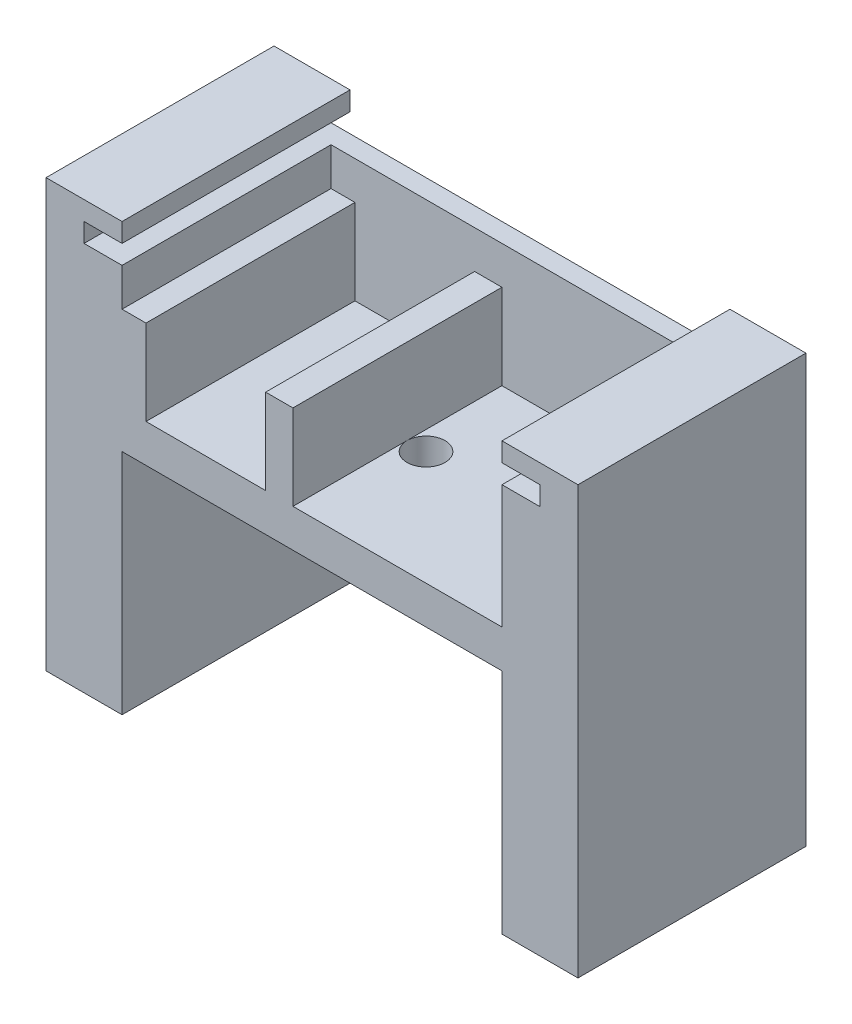
ISO-10303-21;
HEADER;
FILE_DESCRIPTION(('STEP AP214'),'2;1');
FILE_NAME('part.step','',(''),(''),'','','');
FILE_SCHEMA(('AUTOMOTIVE_DESIGN { 1 0 10303 214 1 1 1 1 }'));
ENDSEC;
DATA;
#1=APPLICATION_CONTEXT('core data for automotive mechanical design processes');
#2=APPLICATION_PROTOCOL_DEFINITION('international standard','automotive_design',2000,#1);
#3=PRODUCT_CONTEXT('',#1,'mechanical');
#4=PRODUCT('Part','Part','',(#3));
#5=PRODUCT_RELATED_PRODUCT_CATEGORY('part','',(#4));
#6=PRODUCT_DEFINITION_FORMATION('','',#4);
#7=PRODUCT_DEFINITION_CONTEXT('part definition',#1,'design');
#8=PRODUCT_DEFINITION('design','',#6,#7);
#9=PRODUCT_DEFINITION_SHAPE('','',#8);
#10=(LENGTH_UNIT() NAMED_UNIT(*) SI_UNIT(.MILLI.,.METRE.));
#11=(NAMED_UNIT(*) PLANE_ANGLE_UNIT() SI_UNIT($,.RADIAN.));
#12=(NAMED_UNIT(*) SI_UNIT($,.STERADIAN.) SOLID_ANGLE_UNIT());
#13=UNCERTAINTY_MEASURE_WITH_UNIT(LENGTH_MEASURE(1.E-05),#10,'distance_accuracy_value','');
#14=(GEOMETRIC_REPRESENTATION_CONTEXT(3) GLOBAL_UNCERTAINTY_ASSIGNED_CONTEXT((#13)) GLOBAL_UNIT_ASSIGNED_CONTEXT((#10,
#11,#12)) REPRESENTATION_CONTEXT('',''));
#15=CARTESIAN_POINT('',(0.,0.,0.));
#16=DIRECTION('',(0.,0.,1.));
#17=DIRECTION('',(1.,0.,0.));
#18=AXIS2_PLACEMENT_3D('',#15,#16,#17);
#19=CARTESIAN_POINT('',(63.5,53.9,76.2));
#20=DIRECTION('',(1.,0.,0.));
#21=DIRECTION('',(0.,0.,-1.));
#22=AXIS2_PLACEMENT_3D('',#19,#20,#21);
#23=PLANE('',#22);
#24=DIRECTION('',(0.,1.,0.));
#25=VECTOR('',#24,1.);
#26=CARTESIAN_POINT('',(63.5,53.9,6.35));
#27=LINE('',#26,#25);
#28=CARTESIAN_POINT('',(63.5,12.7,6.35000000000002));
#29=VERTEX_POINT('',#28);
#30=CARTESIAN_POINT('',(63.5,53.9,6.35000000000002));
#31=VERTEX_POINT('',#30);
#32=EDGE_CURVE('E59',#29,#31,#27,.T.);
#33=ORIENTED_EDGE('',*,*,#32,.F.);
#34=DIRECTION('',(0.,0.,-1.));
#35=VECTOR('',#34,1.);
#36=CARTESIAN_POINT('',(63.5,12.7,76.2));
#37=LINE('',#36,#35);
#38=CARTESIAN_POINT('',(63.5,12.7,76.2));
#39=VERTEX_POINT('',#38);
#40=EDGE_CURVE('E364',#39,#29,#37,.T.);
#41=ORIENTED_EDGE('',*,*,#40,.F.);
#42=DIRECTION('',(0.,-1.,0.));
#43=VECTOR('',#42,1.);
#44=CARTESIAN_POINT('',(63.5,53.9,76.2));
#45=LINE('',#44,#43);
#46=CARTESIAN_POINT('',(63.5,53.9,76.2));
#47=VERTEX_POINT('',#46);
#48=EDGE_CURVE('E416',#47,#39,#45,.T.);
#49=ORIENTED_EDGE('',*,*,#48,.F.);
#50=DIRECTION('',(0.,0.,-1.));
#51=VECTOR('',#50,1.);
#52=CARTESIAN_POINT('',(63.5,53.9,76.2));
#53=LINE('',#52,#51);
#54=EDGE_CURVE('E55',#47,#31,#53,.T.);
#55=ORIENTED_EDGE('',*,*,#54,.T.);
#56=EDGE_LOOP('',(#33,#41,#49,#55));
#57=FACE_BOUND('',#56,.T.);
#58=ADVANCED_FACE('F39',(#57),#23,.F.);
#59=CARTESIAN_POINT('',(-6.37146106707273,12.7,76.2));
#60=DIRECTION('',(0.,-1.,0.));
#61=DIRECTION('',(0.,0.,-1.));
#62=AXIS2_PLACEMENT_3D('',#59,#60,#61);
#63=PLANE('',#62);
#64=CARTESIAN_POINT('',(0.,12.7,38.1));
#65=DIRECTION('',(0.,-1.,0.));
#66=DIRECTION('',(0.,0.,-1.));
#67=AXIS2_PLACEMENT_3D('',#64,#65,#66);
#68=CIRCLE('',#67,6.35);
#69=CARTESIAN_POINT('',(0.,12.7,31.75));
#70=VERTEX_POINT('',#69);
#71=EDGE_CURVE('E587',#70,#70,#68,.T.);
#72=ORIENTED_EDGE('',*,*,#71,.T.);
#73=EDGE_LOOP('',(#72));
#74=FACE_BOUND('',#73,.T.);
#75=DIRECTION('',(1.,0.,0.));
#76=VECTOR('',#75,1.);
#77=CARTESIAN_POINT('',(-63.4999999999999,12.7,6.34999999999999));
#78=LINE('',#77,#76);
#79=CARTESIAN_POINT('',(-6.37146106707273,12.7,6.35000000000002));
#80=VERTEX_POINT('',#79);
#81=EDGE_CURVE('E567',#80,#29,#78,.T.);
#82=ORIENTED_EDGE('',*,*,#81,.F.);
#83=DIRECTION('',(0.,0.,-1.));
#84=VECTOR('',#83,1.);
#85=CARTESIAN_POINT('',(-6.37146106707273,12.7,76.2));
#86=LINE('',#85,#84);
#87=CARTESIAN_POINT('',(-6.37146106707273,12.7,76.2));
#88=VERTEX_POINT('',#87);
#89=EDGE_CURVE('E360',#88,#80,#86,.T.);
#90=ORIENTED_EDGE('',*,*,#89,.F.);
#91=DIRECTION('',(-1.,0.,0.));
#92=VECTOR('',#91,1.);
#93=CARTESIAN_POINT('',(-6.37146106707273,12.7,76.2));
#94=LINE('',#93,#92);
#95=EDGE_CURVE('E419',#39,#88,#94,.T.);
#96=ORIENTED_EDGE('',*,*,#95,.F.);
#97=ORIENTED_EDGE('',*,*,#40,.T.);
#98=EDGE_LOOP('',(#82,#90,#96,#97));
#99=FACE_BOUND('',#98,.T.);
#100=ADVANCED_FACE('F526',(#74,#99),#63,.F.);
#101=CARTESIAN_POINT('',(-6.37146106707273,41.2,76.2));
#102=DIRECTION('',(-1.,0.,0.));
#103=DIRECTION('',(0.,0.,1.));
#104=AXIS2_PLACEMENT_3D('',#101,#102,#103);
#105=PLANE('',#104);
#106=DIRECTION('',(0.,-1.,0.));
#107=VECTOR('',#106,1.);
#108=CARTESIAN_POINT('',(-6.37146106707273,41.2,6.34999999999999));
#109=LINE('',#108,#107);
#110=CARTESIAN_POINT('',(-6.37146106707273,41.2,6.35000000000002));
#111=VERTEX_POINT('',#110);
#112=EDGE_CURVE('E241',#111,#80,#109,.T.);
#113=ORIENTED_EDGE('',*,*,#112,.F.);
#114=DIRECTION('',(0.,0.,-1.));
#115=VECTOR('',#114,1.);
#116=CARTESIAN_POINT('',(-6.37146106707273,41.2,76.2));
#117=LINE('',#116,#115);
#118=CARTESIAN_POINT('',(-6.37146106707273,41.2,76.2));
#119=VERTEX_POINT('',#118);
#120=EDGE_CURVE('E356',#119,#111,#117,.T.);
#121=ORIENTED_EDGE('',*,*,#120,.F.);
#122=DIRECTION('',(0.,1.,0.));
#123=VECTOR('',#122,1.);
#124=CARTESIAN_POINT('',(-6.37146106707273,41.2,76.2));
#125=LINE('',#124,#123);
#126=EDGE_CURVE('E422',#88,#119,#125,.T.);
#127=ORIENTED_EDGE('',*,*,#126,.F.);
#128=ORIENTED_EDGE('',*,*,#89,.T.);
#129=EDGE_LOOP('',(#113,#121,#127,#128));
#130=FACE_BOUND('',#129,.T.);
#131=ADVANCED_FACE('F532',(#130),#105,.F.);
#132=CARTESIAN_POINT('',(-15.5,41.2,76.2));
#133=DIRECTION('',(0.,-1.,0.));
#134=DIRECTION('',(0.,0.,-1.));
#135=AXIS2_PLACEMENT_3D('',#132,#133,#134);
#136=PLANE('',#135);
#137=DIRECTION('',(1.,0.,0.));
#138=VECTOR('',#137,1.);
#139=CARTESIAN_POINT('',(-15.5,41.2,6.34999999999999));
#140=LINE('',#139,#138);
#141=CARTESIAN_POINT('',(-15.5,41.2,6.35000000000002));
#142=VERTEX_POINT('',#141);
#143=EDGE_CURVE('E248',#142,#111,#140,.T.);
#144=ORIENTED_EDGE('',*,*,#143,.F.);
#145=DIRECTION('',(0.,0.,-1.));
#146=VECTOR('',#145,1.);
#147=CARTESIAN_POINT('',(-15.5,41.2,76.2));
#148=LINE('',#147,#146);
#149=CARTESIAN_POINT('',(-15.5,41.2,76.2));
#150=VERTEX_POINT('',#149);
#151=EDGE_CURVE('E352',#150,#142,#148,.T.);
#152=ORIENTED_EDGE('',*,*,#151,.F.);
#153=DIRECTION('',(-1.,0.,0.));
#154=VECTOR('',#153,1.);
#155=CARTESIAN_POINT('',(-15.5,41.2,76.2));
#156=LINE('',#155,#154);
#157=EDGE_CURVE('E425',#119,#150,#156,.T.);
#158=ORIENTED_EDGE('',*,*,#157,.F.);
#159=ORIENTED_EDGE('',*,*,#120,.T.);
#160=EDGE_LOOP('',(#144,#152,#158,#159));
#161=FACE_BOUND('',#160,.T.);
#162=ADVANCED_FACE('F535',(#161),#136,.F.);
#163=CARTESIAN_POINT('',(-15.5,12.7,76.2));
#164=DIRECTION('',(1.,0.,0.));
#165=DIRECTION('',(0.,0.,-1.));
#166=AXIS2_PLACEMENT_3D('',#163,#164,#165);
#167=PLANE('',#166);
#168=DIRECTION('',(0.,1.,0.));
#169=VECTOR('',#168,1.);
#170=CARTESIAN_POINT('',(-15.5,12.7,6.34999999999999));
#171=LINE('',#170,#169);
#172=CARTESIAN_POINT('',(-15.5,12.7,6.35000000000002));
#173=VERTEX_POINT('',#172);
#174=EDGE_CURVE('E580',#173,#142,#171,.T.);
#175=ORIENTED_EDGE('',*,*,#174,.F.);
#176=DIRECTION('',(0.,0.,-1.));
#177=VECTOR('',#176,1.);
#178=CARTESIAN_POINT('',(-15.5,12.7,76.2));
#179=LINE('',#178,#177);
#180=CARTESIAN_POINT('',(-15.5,12.7,76.2));
#181=VERTEX_POINT('',#180);
#182=EDGE_CURVE('E348',#181,#173,#179,.T.);
#183=ORIENTED_EDGE('',*,*,#182,.F.);
#184=DIRECTION('',(0.,-1.,0.));
#185=VECTOR('',#184,1.);
#186=CARTESIAN_POINT('',(-15.5,12.7,76.2));
#187=LINE('',#186,#185);
#188=EDGE_CURVE('E428',#150,#181,#187,.T.);
#189=ORIENTED_EDGE('',*,*,#188,.F.);
#190=ORIENTED_EDGE('',*,*,#151,.T.);
#191=EDGE_LOOP('',(#175,#183,#189,#190));
#192=FACE_BOUND('',#191,.T.);
#193=ADVANCED_FACE('F540',(#192),#167,.F.);
#194=CARTESIAN_POINT('',(-55.5,12.7,76.2));
#195=DIRECTION('',(0.,-1.,0.));
#196=DIRECTION('',(0.,0.,-1.));
#197=AXIS2_PLACEMENT_3D('',#194,#195,#196);
#198=PLANE('',#197);
#199=CARTESIAN_POINT('',(-55.5,12.7,6.35000000000002));
#200=VERTEX_POINT('',#199);
#201=EDGE_CURVE('E548',#200,#173,#78,.T.);
#202=ORIENTED_EDGE('',*,*,#201,.F.);
#203=DIRECTION('',(0.,0.,-1.));
#204=VECTOR('',#203,1.);
#205=CARTESIAN_POINT('',(-55.5,12.7,76.2));
#206=LINE('',#205,#204);
#207=CARTESIAN_POINT('',(-55.5,12.7,76.2));
#208=VERTEX_POINT('',#207);
#209=EDGE_CURVE('E344',#208,#200,#206,.T.);
#210=ORIENTED_EDGE('',*,*,#209,.F.);
#211=DIRECTION('',(-1.,0.,0.));
#212=VECTOR('',#211,1.);
#213=CARTESIAN_POINT('',(-55.5,12.7,76.2));
#214=LINE('',#213,#212);
#215=EDGE_CURVE('E431',#181,#208,#214,.T.);
#216=ORIENTED_EDGE('',*,*,#215,.F.);
#217=ORIENTED_EDGE('',*,*,#182,.T.);
#218=EDGE_LOOP('',(#202,#210,#216,#217));
#219=FACE_BOUND('',#218,.T.);
#220=ADVANCED_FACE('F546',(#219),#198,.F.);
#221=CARTESIAN_POINT('',(-55.5,41.2,76.2));
#222=DIRECTION('',(-1.,0.,0.));
#223=DIRECTION('',(0.,-1.,0.));
#224=AXIS2_PLACEMENT_3D('',#221,#222,#223);
#225=PLANE('',#224);
#226=DIRECTION('',(0.,-1.,0.));
#227=VECTOR('',#226,1.);
#228=CARTESIAN_POINT('',(-55.5,41.2,6.34999999999999));
#229=LINE('',#228,#227);
#230=CARTESIAN_POINT('',(-55.5,41.2,6.35000000000002));
#231=VERTEX_POINT('',#230);
#232=EDGE_CURVE('E553',#231,#200,#229,.T.);
#233=ORIENTED_EDGE('',*,*,#232,.F.);
#234=DIRECTION('',(0.,0.,-1.));
#235=VECTOR('',#234,1.);
#236=CARTESIAN_POINT('',(-55.5,41.2,76.2));
#237=LINE('',#236,#235);
#238=CARTESIAN_POINT('',(-55.5,41.2,76.2));
#239=VERTEX_POINT('',#238);
#240=EDGE_CURVE('E340',#239,#231,#237,.T.);
#241=ORIENTED_EDGE('',*,*,#240,.F.);
#242=DIRECTION('',(0.,1.,0.));
#243=VECTOR('',#242,1.);
#244=CARTESIAN_POINT('',(-55.5,41.2,76.2));
#245=LINE('',#244,#243);
#246=EDGE_CURVE('E434',#208,#239,#245,.T.);
#247=ORIENTED_EDGE('',*,*,#246,.F.);
#248=ORIENTED_EDGE('',*,*,#209,.T.);
#249=EDGE_LOOP('',(#233,#241,#247,#248));
#250=FACE_BOUND('',#249,.T.);
#251=ADVANCED_FACE('F551',(#250),#225,.F.);
#252=CARTESIAN_POINT('',(-63.5,41.2,76.2));
#253=DIRECTION('',(0.,-1.,0.));
#254=DIRECTION('',(0.,0.,-1.));
#255=AXIS2_PLACEMENT_3D('',#252,#253,#254);
#256=PLANE('',#255);
#257=DIRECTION('',(1.,0.,0.));
#258=VECTOR('',#257,1.);
#259=CARTESIAN_POINT('',(-63.5,41.2,6.34999999999999));
#260=LINE('',#259,#258);
#261=CARTESIAN_POINT('',(-63.5,41.2,6.35000000000002));
#262=VERTEX_POINT('',#261);
#263=EDGE_CURVE('E575',#262,#231,#260,.T.);
#264=ORIENTED_EDGE('',*,*,#263,.F.);
#265=DIRECTION('',(0.,0.,-1.));
#266=VECTOR('',#265,1.);
#267=CARTESIAN_POINT('',(-63.5,41.2,76.2));
#268=LINE('',#267,#266);
#269=CARTESIAN_POINT('',(-63.5,41.2,76.2));
#270=VERTEX_POINT('',#269);
#271=EDGE_CURVE('E336',#270,#262,#268,.T.);
#272=ORIENTED_EDGE('',*,*,#271,.F.);
#273=DIRECTION('',(-1.,0.,0.));
#274=VECTOR('',#273,1.);
#275=CARTESIAN_POINT('',(-63.5,41.2,76.2));
#276=LINE('',#275,#274);
#277=EDGE_CURVE('E437',#239,#270,#276,.T.);
#278=ORIENTED_EDGE('',*,*,#277,.F.);
#279=ORIENTED_EDGE('',*,*,#240,.T.);
#280=EDGE_LOOP('',(#264,#272,#278,#279));
#281=FACE_BOUND('',#280,.T.);
#282=ADVANCED_FACE('F557',(#281),#256,.F.);
#283=CARTESIAN_POINT('',(-63.5,53.9,76.2));
#284=DIRECTION('',(-1.,0.,0.));
#285=DIRECTION('',(0.,0.,1.));
#286=AXIS2_PLACEMENT_3D('',#283,#284,#285);
#287=PLANE('',#286);
#288=DIRECTION('',(0.,1.,0.));
#289=VECTOR('',#288,1.);
#290=CARTESIAN_POINT('',(-63.4999999999999,53.9,6.35));
#291=LINE('',#290,#289);
#292=CARTESIAN_POINT('',(-63.5,53.9,6.35000000000002));
#293=VERTEX_POINT('',#292);
#294=EDGE_CURVE('E563',#262,#293,#291,.T.);
#295=ORIENTED_EDGE('',*,*,#294,.T.);
#296=DIRECTION('',(0.,0.,-1.));
#297=VECTOR('',#296,1.);
#298=CARTESIAN_POINT('',(-63.5,53.9,76.2));
#299=LINE('',#298,#297);
#300=CARTESIAN_POINT('',(-63.5,53.9,76.2));
#301=VERTEX_POINT('',#300);
#302=EDGE_CURVE('E332',#301,#293,#299,.T.);
#303=ORIENTED_EDGE('',*,*,#302,.F.);
#304=DIRECTION('',(0.,1.,0.));
#305=VECTOR('',#304,1.);
#306=CARTESIAN_POINT('',(-63.5,53.9,76.2));
#307=LINE('',#306,#305);
#308=EDGE_CURVE('E440',#270,#301,#307,.T.);
#309=ORIENTED_EDGE('',*,*,#308,.F.);
#310=ORIENTED_EDGE('',*,*,#271,.T.);
#311=EDGE_LOOP('',(#295,#303,#309,#310));
#312=FACE_BOUND('',#311,.T.);
#313=ADVANCED_FACE('F561',(#312),#287,.F.);
#314=CARTESIAN_POINT('',(63.5,-76.2,76.2));
#315=DIRECTION('',(0.,1.,0.));
#316=DIRECTION('',(0.,0.,1.));
#317=AXIS2_PLACEMENT_3D('',#314,#315,#316);
#318=PLANE('',#317);
#319=DIRECTION('',(1.,0.,0.));
#320=VECTOR('',#319,1.);
#321=CARTESIAN_POINT('',(63.5,-76.2,0.));
#322=LINE('',#321,#320);
#323=CARTESIAN_POINT('',(63.5,-76.2,0.));
#324=VERTEX_POINT('',#323);
#325=CARTESIAN_POINT('',(88.9,-76.2,0.));
#326=VERTEX_POINT('',#325);
#327=EDGE_CURVE('E235',#324,#326,#322,.T.);
#328=ORIENTED_EDGE('',*,*,#327,.T.);
#329=DIRECTION('',(0.,0.,-1.));
#330=VECTOR('',#329,1.);
#331=CARTESIAN_POINT('',(88.9,-76.2,76.2));
#332=LINE('',#331,#330);
#333=CARTESIAN_POINT('',(88.9,-76.2,76.2));
#334=VERTEX_POINT('',#333);
#335=EDGE_CURVE('E11',#334,#326,#332,.T.);
#336=ORIENTED_EDGE('',*,*,#335,.F.);
#337=DIRECTION('',(1.,0.,0.));
#338=VECTOR('',#337,1.);
#339=CARTESIAN_POINT('',(63.5,-76.2,76.2));
#340=LINE('',#339,#338);
#341=CARTESIAN_POINT('',(63.5,-76.2,76.2));
#342=VERTEX_POINT('',#341);
#343=EDGE_CURVE('E222',#342,#334,#340,.T.);
#344=ORIENTED_EDGE('',*,*,#343,.F.);
#345=DIRECTION('',(0.,0.,-1.));
#346=VECTOR('',#345,1.);
#347=CARTESIAN_POINT('',(63.5,-76.2,76.2));
#348=LINE('',#347,#346);
#349=EDGE_CURVE('E236',#342,#324,#348,.T.);
#350=ORIENTED_EDGE('',*,*,#349,.T.);
#351=EDGE_LOOP('',(#328,#336,#344,#350));
#352=FACE_BOUND('',#351,.T.);
#353=ADVANCED_FACE('F41',(#352),#318,.F.);
#354=CARTESIAN_POINT('',(88.9,66.6,76.2));
#355=DIRECTION('',(-1.,0.,0.));
#356=DIRECTION('',(0.,0.,1.));
#357=AXIS2_PLACEMENT_3D('',#354,#355,#356);
#358=PLANE('',#357);
#359=DIRECTION('',(0.,1.,0.));
#360=VECTOR('',#359,1.);
#361=CARTESIAN_POINT('',(88.9,66.6,0.));
#362=LINE('',#361,#360);
#363=CARTESIAN_POINT('',(88.9,66.6,0.));
#364=VERTEX_POINT('',#363);
#365=EDGE_CURVE('E240',#326,#364,#362,.T.);
#366=ORIENTED_EDGE('',*,*,#365,.T.);
#367=DIRECTION('',(0.,0.,-1.));
#368=VECTOR('',#367,1.);
#369=CARTESIAN_POINT('',(88.9,66.6,76.2));
#370=LINE('',#369,#368);
#371=CARTESIAN_POINT('',(88.9,66.6,76.2));
#372=VERTEX_POINT('',#371);
#373=EDGE_CURVE('E48',#372,#364,#370,.T.);
#374=ORIENTED_EDGE('',*,*,#373,.F.);
#375=DIRECTION('',(0.,1.,0.));
#376=VECTOR('',#375,1.);
#377=CARTESIAN_POINT('',(88.9,66.6,76.2));
#378=LINE('',#377,#376);
#379=EDGE_CURVE('E212',#334,#372,#378,.T.);
#380=ORIENTED_EDGE('',*,*,#379,.F.);
#381=ORIENTED_EDGE('',*,*,#335,.T.);
#382=EDGE_LOOP('',(#366,#374,#380,#381));
#383=FACE_BOUND('',#382,.T.);
#384=ADVANCED_FACE('F214',(#383),#358,.F.);
#385=CARTESIAN_POINT('',(63.5,66.6,76.2));
#386=DIRECTION('',(0.,-1.,0.));
#387=DIRECTION('',(0.,0.,-1.));
#388=AXIS2_PLACEMENT_3D('',#385,#386,#387);
#389=PLANE('',#388);
#390=DIRECTION('',(-1.,0.,0.));
#391=VECTOR('',#390,1.);
#392=CARTESIAN_POINT('',(63.5,66.6,0.));
#393=LINE('',#392,#391);
#394=CARTESIAN_POINT('',(63.5,66.6,0.));
#395=VERTEX_POINT('',#394);
#396=EDGE_CURVE('E245',#364,#395,#393,.T.);
#397=ORIENTED_EDGE('',*,*,#396,.T.);
#398=DIRECTION('',(0.,0.,-1.));
#399=VECTOR('',#398,1.);
#400=CARTESIAN_POINT('',(63.5,66.6,76.2));
#401=LINE('',#400,#399);
#402=CARTESIAN_POINT('',(63.5,66.6,76.2));
#403=VERTEX_POINT('',#402);
#404=EDGE_CURVE('E381',#403,#395,#401,.T.);
#405=ORIENTED_EDGE('',*,*,#404,.F.);
#406=DIRECTION('',(-1.,0.,0.));
#407=VECTOR('',#406,1.);
#408=CARTESIAN_POINT('',(63.5,66.6,76.2));
#409=LINE('',#408,#407);
#410=EDGE_CURVE('E221',#372,#403,#409,.T.);
#411=ORIENTED_EDGE('',*,*,#410,.F.);
#412=ORIENTED_EDGE('',*,*,#373,.T.);
#413=EDGE_LOOP('',(#397,#405,#411,#412));
#414=FACE_BOUND('',#413,.T.);
#415=ADVANCED_FACE('F387',(#414),#389,.F.);
#416=CARTESIAN_POINT('',(63.5,66.6,76.2));
#417=DIRECTION('',(1.,0.,0.));
#418=DIRECTION('',(0.,0.,-1.));
#419=AXIS2_PLACEMENT_3D('',#416,#417,#418);
#420=PLANE('',#419);
#421=DIRECTION('',(0.,-1.,0.));
#422=VECTOR('',#421,1.);
#423=CARTESIAN_POINT('',(63.5,66.6,0.));
#424=LINE('',#423,#422);
#425=CARTESIAN_POINT('',(63.5,60.25,0.));
#426=VERTEX_POINT('',#425);
#427=EDGE_CURVE('E255',#395,#426,#424,.T.);
#428=ORIENTED_EDGE('',*,*,#427,.T.);
#429=DIRECTION('',(0.,0.,-1.));
#430=VECTOR('',#429,1.);
#431=CARTESIAN_POINT('',(63.5,60.25,76.2));
#432=LINE('',#431,#430);
#433=CARTESIAN_POINT('',(63.5,60.25,76.2));
#434=VERTEX_POINT('',#433);
#435=EDGE_CURVE('E377',#434,#426,#432,.T.);
#436=ORIENTED_EDGE('',*,*,#435,.F.);
#437=DIRECTION('',(0.,-1.,0.));
#438=VECTOR('',#437,1.);
#439=CARTESIAN_POINT('',(63.5,66.6,76.2));
#440=LINE('',#439,#438);
#441=EDGE_CURVE('E405',#403,#434,#440,.T.);
#442=ORIENTED_EDGE('',*,*,#441,.F.);
#443=ORIENTED_EDGE('',*,*,#404,.T.);
#444=EDGE_LOOP('',(#428,#436,#442,#443));
#445=FACE_BOUND('',#444,.T.);
#446=ADVANCED_FACE('F395',(#445),#420,.F.);
#447=CARTESIAN_POINT('',(63.5,60.25,76.2));
#448=DIRECTION('',(0.,1.,0.));
#449=DIRECTION('',(0.,0.,1.));
#450=AXIS2_PLACEMENT_3D('',#447,#448,#449);
#451=PLANE('',#450);
#452=DIRECTION('',(1.,0.,0.));
#453=VECTOR('',#452,1.);
#454=CARTESIAN_POINT('',(63.5,60.25,0.));
#455=LINE('',#454,#453);
#456=CARTESIAN_POINT('',(76.2,60.25,0.));
#457=VERTEX_POINT('',#456);
#458=EDGE_CURVE('E258',#426,#457,#455,.T.);
#459=ORIENTED_EDGE('',*,*,#458,.T.);
#460=DIRECTION('',(0.,0.,-1.));
#461=VECTOR('',#460,1.);
#462=CARTESIAN_POINT('',(76.2,60.25,76.2));
#463=LINE('',#462,#461);
#464=CARTESIAN_POINT('',(76.2,60.25,76.2));
#465=VERTEX_POINT('',#464);
#466=EDGE_CURVE('E373',#465,#457,#463,.T.);
#467=ORIENTED_EDGE('',*,*,#466,.F.);
#468=DIRECTION('',(1.,0.,0.));
#469=VECTOR('',#468,1.);
#470=CARTESIAN_POINT('',(63.5,60.25,76.2));
#471=LINE('',#470,#469);
#472=EDGE_CURVE('E401',#434,#465,#471,.T.);
#473=ORIENTED_EDGE('',*,*,#472,.F.);
#474=ORIENTED_EDGE('',*,*,#435,.T.);
#475=EDGE_LOOP('',(#459,#467,#473,#474));
#476=FACE_BOUND('',#475,.T.);
#477=ADVANCED_FACE('F399',(#476),#451,.F.);
#478=CARTESIAN_POINT('',(76.2,60.25,76.2));
#479=DIRECTION('',(1.,0.,0.));
#480=DIRECTION('',(0.,0.,-1.));
#481=AXIS2_PLACEMENT_3D('',#478,#479,#480);
#482=PLANE('',#481);
#483=DIRECTION('',(0.,-1.,0.));
#484=VECTOR('',#483,1.);
#485=CARTESIAN_POINT('',(76.2,60.25,0.));
#486=LINE('',#485,#484);
#487=CARTESIAN_POINT('',(76.2,53.9,0.));
#488=VERTEX_POINT('',#487);
#489=EDGE_CURVE('E261',#457,#488,#486,.T.);
#490=ORIENTED_EDGE('',*,*,#489,.T.);
#491=DIRECTION('',(0.,0.,-1.));
#492=VECTOR('',#491,1.);
#493=CARTESIAN_POINT('',(76.2,53.9,76.2));
#494=LINE('',#493,#492);
#495=CARTESIAN_POINT('',(76.2,53.9,76.2));
#496=VERTEX_POINT('',#495);
#497=EDGE_CURVE('E369',#496,#488,#494,.T.);
#498=ORIENTED_EDGE('',*,*,#497,.F.);
#499=DIRECTION('',(0.,-1.,0.));
#500=VECTOR('',#499,1.);
#501=CARTESIAN_POINT('',(76.2,60.25,76.2));
#502=LINE('',#501,#500);
#503=EDGE_CURVE('E404',#465,#496,#502,.T.);
#504=ORIENTED_EDGE('',*,*,#503,.F.);
#505=ORIENTED_EDGE('',*,*,#466,.T.);
#506=EDGE_LOOP('',(#490,#498,#504,#505));
#507=FACE_BOUND('',#506,.T.);
#508=ADVANCED_FACE('F518',(#507),#482,.F.);
#509=CARTESIAN_POINT('',(-76.2,53.9,76.2));
#510=DIRECTION('',(0.,-1.,0.));
#511=DIRECTION('',(0.,0.,-1.));
#512=AXIS2_PLACEMENT_3D('',#509,#510,#511);
#513=PLANE('',#512);
#514=DIRECTION('',(-1.,0.,0.));
#515=VECTOR('',#514,1.);
#516=CARTESIAN_POINT('',(-76.2,53.9,0.));
#517=LINE('',#516,#515);
#518=CARTESIAN_POINT('',(-76.2,53.9,0.));
#519=VERTEX_POINT('',#518);
#520=EDGE_CURVE('E265',#488,#519,#517,.T.);
#521=ORIENTED_EDGE('',*,*,#520,.T.);
#522=DIRECTION('',(0.,0.,-1.));
#523=VECTOR('',#522,1.);
#524=CARTESIAN_POINT('',(-76.2,53.9,76.2));
#525=LINE('',#524,#523);
#526=CARTESIAN_POINT('',(-76.2,53.9,76.2));
#527=VERTEX_POINT('',#526);
#528=EDGE_CURVE('E328',#527,#519,#525,.T.);
#529=ORIENTED_EDGE('',*,*,#528,.F.);
#530=DIRECTION('',(-1.,0.,0.));
#531=VECTOR('',#530,1.);
#532=CARTESIAN_POINT('',(-76.2,53.9,76.2));
#533=LINE('',#532,#531);
#534=EDGE_CURVE('E443',#301,#527,#533,.T.);
#535=ORIENTED_EDGE('',*,*,#534,.F.);
#536=ORIENTED_EDGE('',*,*,#302,.T.);
#537=DIRECTION('',(1.,0.,0.));
#538=VECTOR('',#537,1.);
#539=CARTESIAN_POINT('',(-63.4999999999999,53.9,6.35));
#540=LINE('',#539,#538);
#541=EDGE_CURVE('E521',#293,#31,#540,.T.);
#542=ORIENTED_EDGE('',*,*,#541,.T.);
#543=ORIENTED_EDGE('',*,*,#54,.F.);
#544=DIRECTION('',(-1.,0.,0.));
#545=VECTOR('',#544,1.);
#546=CARTESIAN_POINT('',(76.2,53.9,76.2));
#547=LINE('',#546,#545);
#548=EDGE_CURVE('E409',#496,#47,#547,.T.);
#549=ORIENTED_EDGE('',*,*,#548,.F.);
#550=ORIENTED_EDGE('',*,*,#497,.T.);
#551=EDGE_LOOP('',(#521,#529,#535,#536,#542,#543,#549,#550));
#552=FACE_BOUND('',#551,.T.);
#553=ADVANCED_FACE('F514',(#552),#513,.F.);
#554=CARTESIAN_POINT('',(-76.2,60.25,76.2));
#555=DIRECTION('',(-1.,0.,0.));
#556=DIRECTION('',(0.,-1.,0.));
#557=AXIS2_PLACEMENT_3D('',#554,#555,#556);
#558=PLANE('',#557);
#559=DIRECTION('',(0.,1.,0.));
#560=VECTOR('',#559,1.);
#561=CARTESIAN_POINT('',(-76.2,60.25,0.));
#562=LINE('',#561,#560);
#563=CARTESIAN_POINT('',(-76.2,60.25,0.));
#564=VERTEX_POINT('',#563);
#565=EDGE_CURVE('E268',#519,#564,#562,.T.);
#566=ORIENTED_EDGE('',*,*,#565,.T.);
#567=DIRECTION('',(0.,0.,-1.));
#568=VECTOR('',#567,1.);
#569=CARTESIAN_POINT('',(-76.2,60.25,76.2));
#570=LINE('',#569,#568);
#571=CARTESIAN_POINT('',(-76.2,60.25,76.2));
#572=VERTEX_POINT('',#571);
#573=EDGE_CURVE('E324',#572,#564,#570,.T.);
#574=ORIENTED_EDGE('',*,*,#573,.F.);
#575=DIRECTION('',(0.,1.,0.));
#576=VECTOR('',#575,1.);
#577=CARTESIAN_POINT('',(-76.2,60.25,76.2));
#578=LINE('',#577,#576);
#579=EDGE_CURVE('E446',#527,#572,#578,.T.);
#580=ORIENTED_EDGE('',*,*,#579,.F.);
#581=ORIENTED_EDGE('',*,*,#528,.T.);
#582=EDGE_LOOP('',(#566,#574,#580,#581));
#583=FACE_BOUND('',#582,.T.);
#584=ADVANCED_FACE('F509',(#583),#558,.F.);
#585=CARTESIAN_POINT('',(-63.5,60.25,76.2));
#586=DIRECTION('',(0.,1.,0.));
#587=DIRECTION('',(0.,0.,1.));
#588=AXIS2_PLACEMENT_3D('',#585,#586,#587);
#589=PLANE('',#588);
#590=DIRECTION('',(1.,0.,0.));
#591=VECTOR('',#590,1.);
#592=CARTESIAN_POINT('',(-63.5,60.25,0.));
#593=LINE('',#592,#591);
#594=CARTESIAN_POINT('',(-63.5,60.25,0.));
#595=VERTEX_POINT('',#594);
#596=EDGE_CURVE('E271',#564,#595,#593,.T.);
#597=ORIENTED_EDGE('',*,*,#596,.T.);
#598=DIRECTION('',(0.,0.,-1.));
#599=VECTOR('',#598,1.);
#600=CARTESIAN_POINT('',(-63.5,60.25,76.2));
#601=LINE('',#600,#599);
#602=CARTESIAN_POINT('',(-63.5,60.25,76.2));
#603=VERTEX_POINT('',#602);
#604=EDGE_CURVE('E320',#603,#595,#601,.T.);
#605=ORIENTED_EDGE('',*,*,#604,.F.);
#606=DIRECTION('',(1.,0.,0.));
#607=VECTOR('',#606,1.);
#608=CARTESIAN_POINT('',(-63.5,60.25,76.2));
#609=LINE('',#608,#607);
#610=EDGE_CURVE('E449',#572,#603,#609,.T.);
#611=ORIENTED_EDGE('',*,*,#610,.F.);
#612=ORIENTED_EDGE('',*,*,#573,.T.);
#613=EDGE_LOOP('',(#597,#605,#611,#612));
#614=FACE_BOUND('',#613,.T.);
#615=ADVANCED_FACE('F505',(#614),#589,.F.);
#616=CARTESIAN_POINT('',(-63.5,66.6,76.2));
#617=DIRECTION('',(-1.,0.,0.));
#618=DIRECTION('',(0.,0.,1.));
#619=AXIS2_PLACEMENT_3D('',#616,#617,#618);
#620=PLANE('',#619);
#621=DIRECTION('',(0.,1.,0.));
#622=VECTOR('',#621,1.);
#623=CARTESIAN_POINT('',(-63.5,66.6,0.));
#624=LINE('',#623,#622);
#625=CARTESIAN_POINT('',(-63.5,66.6,0.));
#626=VERTEX_POINT('',#625);
#627=EDGE_CURVE('E274',#595,#626,#624,.T.);
#628=ORIENTED_EDGE('',*,*,#627,.T.);
#629=DIRECTION('',(0.,0.,-1.));
#630=VECTOR('',#629,1.);
#631=CARTESIAN_POINT('',(-63.5,66.6,76.2));
#632=LINE('',#631,#630);
#633=CARTESIAN_POINT('',(-63.5,66.6,76.2));
#634=VERTEX_POINT('',#633);
#635=EDGE_CURVE('E316',#634,#626,#632,.T.);
#636=ORIENTED_EDGE('',*,*,#635,.F.);
#637=DIRECTION('',(0.,1.,0.));
#638=VECTOR('',#637,1.);
#639=CARTESIAN_POINT('',(-63.5,66.6,76.2));
#640=LINE('',#639,#638);
#641=EDGE_CURVE('E452',#603,#634,#640,.T.);
#642=ORIENTED_EDGE('',*,*,#641,.F.);
#643=ORIENTED_EDGE('',*,*,#604,.T.);
#644=EDGE_LOOP('',(#628,#636,#642,#643));
#645=FACE_BOUND('',#644,.T.);
#646=ADVANCED_FACE('F501',(#645),#620,.F.);
#647=CARTESIAN_POINT('',(-88.9,66.6,76.2));
#648=DIRECTION('',(0.,-1.,0.));
#649=DIRECTION('',(0.,0.,-1.));
#650=AXIS2_PLACEMENT_3D('',#647,#648,#649);
#651=PLANE('',#650);
#652=DIRECTION('',(-1.,0.,0.));
#653=VECTOR('',#652,1.);
#654=CARTESIAN_POINT('',(-88.9,66.6,0.));
#655=LINE('',#654,#653);
#656=CARTESIAN_POINT('',(-88.9,66.6,0.));
#657=VERTEX_POINT('',#656);
#658=EDGE_CURVE('E277',#626,#657,#655,.T.);
#659=ORIENTED_EDGE('',*,*,#658,.T.);
#660=DIRECTION('',(0.,0.,-1.));
#661=VECTOR('',#660,1.);
#662=CARTESIAN_POINT('',(-88.9,66.6,76.2));
#663=LINE('',#662,#661);
#664=CARTESIAN_POINT('',(-88.9,66.6,76.2));
#665=VERTEX_POINT('',#664);
#666=EDGE_CURVE('E312',#665,#657,#663,.T.);
#667=ORIENTED_EDGE('',*,*,#666,.F.);
#668=DIRECTION('',(-1.,0.,0.));
#669=VECTOR('',#668,1.);
#670=CARTESIAN_POINT('',(-88.9,66.6,76.2));
#671=LINE('',#670,#669);
#672=EDGE_CURVE('E455',#634,#665,#671,.T.);
#673=ORIENTED_EDGE('',*,*,#672,.F.);
#674=ORIENTED_EDGE('',*,*,#635,.T.);
#675=EDGE_LOOP('',(#659,#667,#673,#674));
#676=FACE_BOUND('',#675,.T.);
#677=ADVANCED_FACE('F496',(#676),#651,.F.);
#678=CARTESIAN_POINT('',(-88.9,-76.2,76.2));
#679=DIRECTION('',(1.,0.,0.));
#680=DIRECTION('',(0.,0.,-1.));
#681=AXIS2_PLACEMENT_3D('',#678,#679,#680);
#682=PLANE('',#681);
#683=DIRECTION('',(0.,-1.,0.));
#684=VECTOR('',#683,1.);
#685=CARTESIAN_POINT('',(-88.9,-76.2,0.));
#686=LINE('',#685,#684);
#687=CARTESIAN_POINT('',(-88.9,-76.2,0.));
#688=VERTEX_POINT('',#687);
#689=EDGE_CURVE('E280',#657,#688,#686,.T.);
#690=ORIENTED_EDGE('',*,*,#689,.T.);
#691=DIRECTION('',(0.,0.,-1.));
#692=VECTOR('',#691,1.);
#693=CARTESIAN_POINT('',(-88.9,-76.2,76.2));
#694=LINE('',#693,#692);
#695=CARTESIAN_POINT('',(-88.9,-76.2,76.2));
#696=VERTEX_POINT('',#695);
#697=EDGE_CURVE('E308',#696,#688,#694,.T.);
#698=ORIENTED_EDGE('',*,*,#697,.F.);
#699=DIRECTION('',(0.,-1.,0.));
#700=VECTOR('',#699,1.);
#701=CARTESIAN_POINT('',(-88.9,-76.2,76.2));
#702=LINE('',#701,#700);
#703=EDGE_CURVE('E458',#665,#696,#702,.T.);
#704=ORIENTED_EDGE('',*,*,#703,.F.);
#705=ORIENTED_EDGE('',*,*,#666,.T.);
#706=EDGE_LOOP('',(#690,#698,#704,#705));
#707=FACE_BOUND('',#706,.T.);
#708=ADVANCED_FACE('F490',(#707),#682,.F.);
#709=CARTESIAN_POINT('',(-63.5,-76.2,76.2));
#710=DIRECTION('',(0.,1.,0.));
#711=DIRECTION('',(0.,0.,1.));
#712=AXIS2_PLACEMENT_3D('',#709,#710,#711);
#713=PLANE('',#712);
#714=DIRECTION('',(1.,0.,0.));
#715=VECTOR('',#714,1.);
#716=CARTESIAN_POINT('',(-63.5,-76.2,0.));
#717=LINE('',#716,#715);
#718=CARTESIAN_POINT('',(-63.5,-76.2,0.));
#719=VERTEX_POINT('',#718);
#720=EDGE_CURVE('E283',#688,#719,#717,.T.);
#721=ORIENTED_EDGE('',*,*,#720,.T.);
#722=DIRECTION('',(0.,0.,-1.));
#723=VECTOR('',#722,1.);
#724=CARTESIAN_POINT('',(-63.5,-76.2,76.2));
#725=LINE('',#724,#723);
#726=CARTESIAN_POINT('',(-63.5,-76.2,76.2));
#727=VERTEX_POINT('',#726);
#728=EDGE_CURVE('E304',#727,#719,#725,.T.);
#729=ORIENTED_EDGE('',*,*,#728,.F.);
#730=DIRECTION('',(1.,0.,0.));
#731=VECTOR('',#730,1.);
#732=CARTESIAN_POINT('',(-63.5,-76.2,76.2));
#733=LINE('',#732,#731);
#734=EDGE_CURVE('E461',#696,#727,#733,.T.);
#735=ORIENTED_EDGE('',*,*,#734,.F.);
#736=ORIENTED_EDGE('',*,*,#697,.T.);
#737=EDGE_LOOP('',(#721,#729,#735,#736));
#738=FACE_BOUND('',#737,.T.);
#739=ADVANCED_FACE('F486',(#738),#713,.F.);
#740=CARTESIAN_POINT('',(-63.5,0.,76.2));
#741=DIRECTION('',(-1.,0.,0.));
#742=DIRECTION('',(0.,-1.,0.));
#743=AXIS2_PLACEMENT_3D('',#740,#741,#742);
#744=PLANE('',#743);
#745=DIRECTION('',(0.,1.,0.));
#746=VECTOR('',#745,1.);
#747=CARTESIAN_POINT('',(-63.5,0.,0.));
#748=LINE('',#747,#746);
#749=CARTESIAN_POINT('',(-63.5,0.,0.));
#750=VERTEX_POINT('',#749);
#751=EDGE_CURVE('E286',#719,#750,#748,.T.);
#752=ORIENTED_EDGE('',*,*,#751,.T.);
#753=DIRECTION('',(0.,0.,-1.));
#754=VECTOR('',#753,1.);
#755=CARTESIAN_POINT('',(-63.5,0.,76.2));
#756=LINE('',#755,#754);
#757=CARTESIAN_POINT('',(-63.5,0.,76.2));
#758=VERTEX_POINT('',#757);
#759=EDGE_CURVE('E300',#758,#750,#756,.T.);
#760=ORIENTED_EDGE('',*,*,#759,.F.);
#761=DIRECTION('',(0.,1.,0.));
#762=VECTOR('',#761,1.);
#763=CARTESIAN_POINT('',(-63.5,0.,76.2));
#764=LINE('',#763,#762);
#765=EDGE_CURVE('E464',#727,#758,#764,.T.);
#766=ORIENTED_EDGE('',*,*,#765,.F.);
#767=ORIENTED_EDGE('',*,*,#728,.T.);
#768=EDGE_LOOP('',(#752,#760,#766,#767));
#769=FACE_BOUND('',#768,.T.);
#770=ADVANCED_FACE('F482',(#769),#744,.F.);
#771=CARTESIAN_POINT('',(-63.5,0.,76.2));
#772=DIRECTION('',(0.,1.,0.));
#773=DIRECTION('',(0.,0.,1.));
#774=AXIS2_PLACEMENT_3D('',#771,#772,#773);
#775=PLANE('',#774);
#776=CARTESIAN_POINT('',(0.,0.,38.1));
#777=DIRECTION('',(0.,-1.,0.));
#778=DIRECTION('',(0.,0.,-1.));
#779=AXIS2_PLACEMENT_3D('',#776,#777,#778);
#780=CIRCLE('',#779,6.35);
#781=CARTESIAN_POINT('',(0.,0.,31.75));
#782=VERTEX_POINT('',#781);
#783=EDGE_CURVE('E592',#782,#782,#780,.T.);
#784=ORIENTED_EDGE('',*,*,#783,.F.);
#785=EDGE_LOOP('',(#784));
#786=FACE_BOUND('',#785,.T.);
#787=DIRECTION('',(1.,0.,0.));
#788=VECTOR('',#787,1.);
#789=CARTESIAN_POINT('',(-63.5,0.,0.));
#790=LINE('',#789,#788);
#791=CARTESIAN_POINT('',(63.5,0.,0.));
#792=VERTEX_POINT('',#791);
#793=EDGE_CURVE('E289',#750,#792,#790,.T.);
#794=ORIENTED_EDGE('',*,*,#793,.T.);
#795=DIRECTION('',(0.,0.,-1.));
#796=VECTOR('',#795,1.);
#797=CARTESIAN_POINT('',(63.5,0.,76.2));
#798=LINE('',#797,#796);
#799=CARTESIAN_POINT('',(63.5,0.,76.2));
#800=VERTEX_POINT('',#799);
#801=EDGE_CURVE('E296',#800,#792,#798,.T.);
#802=ORIENTED_EDGE('',*,*,#801,.F.);
#803=DIRECTION('',(1.,0.,0.));
#804=VECTOR('',#803,1.);
#805=CARTESIAN_POINT('',(-63.5,0.,76.2));
#806=LINE('',#805,#804);
#807=EDGE_CURVE('E466',#758,#800,#806,.T.);
#808=ORIENTED_EDGE('',*,*,#807,.F.);
#809=ORIENTED_EDGE('',*,*,#759,.T.);
#810=EDGE_LOOP('',(#794,#802,#808,#809));
#811=FACE_BOUND('',#810,.T.);
#812=ADVANCED_FACE('F474',(#786,#811),#775,.F.);
#813=CARTESIAN_POINT('',(63.5,0.,76.2));
#814=DIRECTION('',(1.,0.,0.));
#815=DIRECTION('',(0.,0.,-1.));
#816=AXIS2_PLACEMENT_3D('',#813,#814,#815);
#817=PLANE('',#816);
#818=DIRECTION('',(0.,-1.,0.));
#819=VECTOR('',#818,1.);
#820=CARTESIAN_POINT('',(63.5,0.,0.));
#821=LINE('',#820,#819);
#822=EDGE_CURVE('E232',#792,#324,#821,.T.);
#823=ORIENTED_EDGE('',*,*,#822,.T.);
#824=ORIENTED_EDGE('',*,*,#349,.F.);
#825=DIRECTION('',(0.,-1.,0.));
#826=VECTOR('',#825,1.);
#827=CARTESIAN_POINT('',(63.5,0.,76.2));
#828=LINE('',#827,#826);
#829=EDGE_CURVE('E227',#800,#342,#828,.T.);
#830=ORIENTED_EDGE('',*,*,#829,.F.);
#831=ORIENTED_EDGE('',*,*,#801,.T.);
#832=EDGE_LOOP('',(#823,#824,#830,#831));
#833=FACE_BOUND('',#832,.T.);
#834=ADVANCED_FACE('F477',(#833),#817,.F.);
#835=CARTESIAN_POINT('',(0.,0.,76.2));
#836=DIRECTION('',(0.,0.,-1.));
#837=DIRECTION('',(-1.,0.,0.));
#838=AXIS2_PLACEMENT_3D('',#835,#836,#837);
#839=PLANE('',#838);
#840=ORIENTED_EDGE('',*,*,#343,.T.);
#841=ORIENTED_EDGE('',*,*,#379,.T.);
#842=ORIENTED_EDGE('',*,*,#410,.T.);
#843=ORIENTED_EDGE('',*,*,#441,.T.);
#844=ORIENTED_EDGE('',*,*,#472,.T.);
#845=ORIENTED_EDGE('',*,*,#503,.T.);
#846=ORIENTED_EDGE('',*,*,#548,.T.);
#847=ORIENTED_EDGE('',*,*,#48,.T.);
#848=ORIENTED_EDGE('',*,*,#95,.T.);
#849=ORIENTED_EDGE('',*,*,#126,.T.);
#850=ORIENTED_EDGE('',*,*,#157,.T.);
#851=ORIENTED_EDGE('',*,*,#188,.T.);
#852=ORIENTED_EDGE('',*,*,#215,.T.);
#853=ORIENTED_EDGE('',*,*,#246,.T.);
#854=ORIENTED_EDGE('',*,*,#277,.T.);
#855=ORIENTED_EDGE('',*,*,#308,.T.);
#856=ORIENTED_EDGE('',*,*,#534,.T.);
#857=ORIENTED_EDGE('',*,*,#579,.T.);
#858=ORIENTED_EDGE('',*,*,#610,.T.);
#859=ORIENTED_EDGE('',*,*,#641,.T.);
#860=ORIENTED_EDGE('',*,*,#672,.T.);
#861=ORIENTED_EDGE('',*,*,#703,.T.);
#862=ORIENTED_EDGE('',*,*,#734,.T.);
#863=ORIENTED_EDGE('',*,*,#765,.T.);
#864=ORIENTED_EDGE('',*,*,#807,.T.);
#865=ORIENTED_EDGE('',*,*,#829,.T.);
#866=EDGE_LOOP('',(#840,#841,#842,#843,#844,#845,#846,#847,#848,#849,#850,#851,#852,#853,#854,
#855,#856,#857,#858,#859,#860,#861,#862,#863,#864,#865));
#867=FACE_BOUND('',#866,.T.);
#868=ADVANCED_FACE('F225',(#867),#839,.F.);
#869=CARTESIAN_POINT('',(0.,0.,0.));
#870=DIRECTION('',(0.,0.,-1.));
#871=DIRECTION('',(-1.,0.,0.));
#872=AXIS2_PLACEMENT_3D('',#869,#870,#871);
#873=PLANE('',#872);
#874=ORIENTED_EDGE('',*,*,#520,.F.);
#875=ORIENTED_EDGE('',*,*,#489,.F.);
#876=ORIENTED_EDGE('',*,*,#458,.F.);
#877=ORIENTED_EDGE('',*,*,#427,.F.);
#878=ORIENTED_EDGE('',*,*,#396,.F.);
#879=ORIENTED_EDGE('',*,*,#365,.F.);
#880=ORIENTED_EDGE('',*,*,#327,.F.);
#881=ORIENTED_EDGE('',*,*,#822,.F.);
#882=ORIENTED_EDGE('',*,*,#793,.F.);
#883=ORIENTED_EDGE('',*,*,#751,.F.);
#884=ORIENTED_EDGE('',*,*,#720,.F.);
#885=ORIENTED_EDGE('',*,*,#689,.F.);
#886=ORIENTED_EDGE('',*,*,#658,.F.);
#887=ORIENTED_EDGE('',*,*,#627,.F.);
#888=ORIENTED_EDGE('',*,*,#596,.F.);
#889=ORIENTED_EDGE('',*,*,#565,.F.);
#890=EDGE_LOOP('',(#874,#875,#876,#877,#878,#879,#880,#881,#882,#883,#884,#885,#886,#887,#888,#889));
#891=FACE_BOUND('',#890,.T.);
#892=ADVANCED_FACE('F390',(#891),#873,.T.);
#893=CARTESIAN_POINT('',(-63.4999999999999,53.9,6.35));
#894=DIRECTION('',(0.,0.,-1.));
#895=DIRECTION('',(0.,1.,0.));
#896=AXIS2_PLACEMENT_3D('',#893,#894,#895);
#897=PLANE('',#896);
#898=ORIENTED_EDGE('',*,*,#143,.T.);
#899=ORIENTED_EDGE('',*,*,#112,.T.);
#900=ORIENTED_EDGE('',*,*,#81,.T.);
#901=ORIENTED_EDGE('',*,*,#32,.T.);
#902=ORIENTED_EDGE('',*,*,#541,.F.);
#903=ORIENTED_EDGE('',*,*,#294,.F.);
#904=ORIENTED_EDGE('',*,*,#263,.T.);
#905=ORIENTED_EDGE('',*,*,#232,.T.);
#906=ORIENTED_EDGE('',*,*,#201,.T.);
#907=ORIENTED_EDGE('',*,*,#174,.T.);
#908=EDGE_LOOP('',(#898,#899,#900,#901,#902,#903,#904,#905,#906,#907));
#909=FACE_BOUND('',#908,.T.);
#910=ADVANCED_FACE('F565',(#909),#897,.F.);
#911=CARTESIAN_POINT('',(0.,105.2,38.1));
#912=DIRECTION('',(0.,-1.,0.));
#913=DIRECTION('',(0.,0.,-1.));
#914=AXIS2_PLACEMENT_3D('',#911,#912,#913);
#915=CYLINDRICAL_SURFACE('',#914,6.35);
#916=ORIENTED_EDGE('',*,*,#783,.T.);
#917=EDGE_LOOP('',(#916));
#918=FACE_BOUND('',#917,.T.);
#919=ORIENTED_EDGE('',*,*,#71,.F.);
#920=EDGE_LOOP('',(#919));
#921=FACE_BOUND('',#920,.T.);
#922=ADVANCED_FACE('F597',(#918,#921),#915,.F.);
#923=CLOSED_SHELL('',(#58,#100,#131,#162,#193,#220,#251,#282,#313,#353,#384,#415,#446,#477,#508,
#553,#584,#615,#646,#677,#708,#739,#770,#812,#834,#868,#892,#910,#922));
#924=MANIFOLD_SOLID_BREP('B2',#923);
#925=ADVANCED_BREP_SHAPE_REPRESENTATION('',(#18,#924),#14);
#926=SHAPE_DEFINITION_REPRESENTATION(#9,#925);
ENDSEC;
END-ISO-10303-21;
